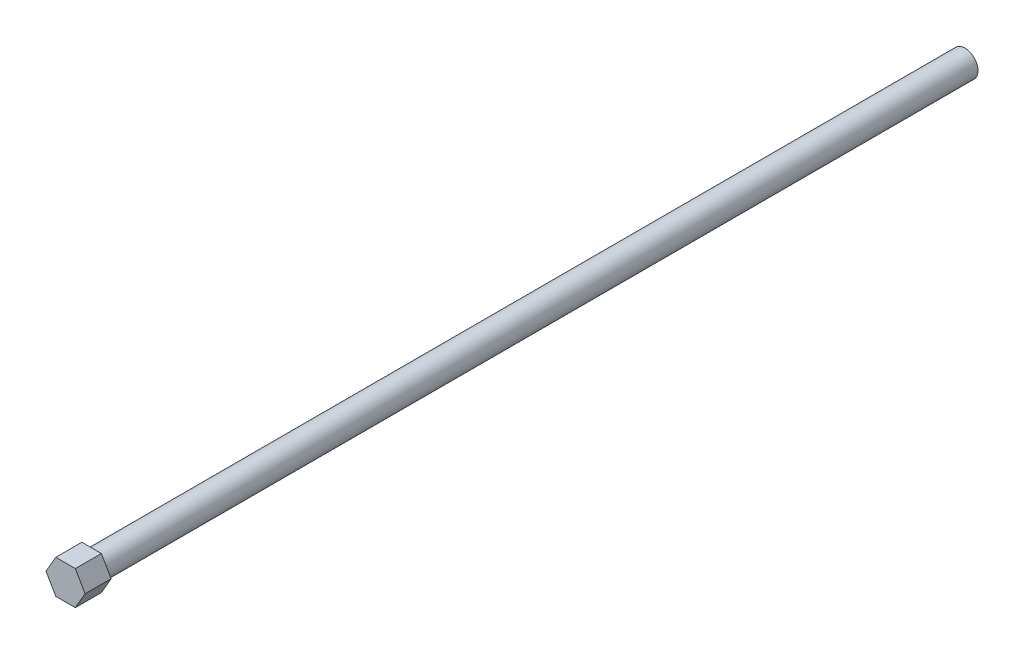
ISO-10303-21;
HEADER;
FILE_DESCRIPTION(('STEP AP214'),'2;1');
FILE_NAME('part.step','',(''),(''),'','','');
FILE_SCHEMA(('AUTOMOTIVE_DESIGN { 1 0 10303 214 1 1 1 1 }'));
ENDSEC;
DATA;
#1=APPLICATION_CONTEXT('core data for automotive mechanical design processes');
#2=APPLICATION_PROTOCOL_DEFINITION('international standard','automotive_design',2000,#1);
#3=PRODUCT_CONTEXT('',#1,'mechanical');
#4=PRODUCT('Part','Part','',(#3));
#5=PRODUCT_RELATED_PRODUCT_CATEGORY('part','',(#4));
#6=PRODUCT_DEFINITION_FORMATION('','',#4);
#7=PRODUCT_DEFINITION_CONTEXT('part definition',#1,'design');
#8=PRODUCT_DEFINITION('design','',#6,#7);
#9=PRODUCT_DEFINITION_SHAPE('','',#8);
#10=(LENGTH_UNIT() NAMED_UNIT(*) SI_UNIT(.MILLI.,.METRE.));
#11=(NAMED_UNIT(*) PLANE_ANGLE_UNIT() SI_UNIT($,.RADIAN.));
#12=(NAMED_UNIT(*) SI_UNIT($,.STERADIAN.) SOLID_ANGLE_UNIT());
#13=UNCERTAINTY_MEASURE_WITH_UNIT(LENGTH_MEASURE(1.E-05),#10,'distance_accuracy_value','');
#14=(GEOMETRIC_REPRESENTATION_CONTEXT(3) GLOBAL_UNCERTAINTY_ASSIGNED_CONTEXT((#13)) GLOBAL_UNIT_ASSIGNED_CONTEXT((#10,
#11,#12)) REPRESENTATION_CONTEXT('',''));
#15=CARTESIAN_POINT('',(0.,0.,0.));
#16=DIRECTION('',(0.,0.,1.));
#17=DIRECTION('',(1.,0.,0.));
#18=AXIS2_PLACEMENT_3D('',#15,#16,#17);
#19=CARTESIAN_POINT('',(0.,0.,280.));
#20=DIRECTION('',(0.,0.,-1.));
#21=DIRECTION('',(-1.,0.,0.));
#22=AXIS2_PLACEMENT_3D('',#19,#20,#21);
#23=CYLINDRICAL_SURFACE('',#22,5.);
#24=CARTESIAN_POINT('',(0.,0.,280.));
#25=DIRECTION('',(0.,0.,1.));
#26=DIRECTION('',(1.,0.,0.));
#27=AXIS2_PLACEMENT_3D('',#24,#25,#26);
#28=CIRCLE('',#27,5.);
#29=CARTESIAN_POINT('',(5.,0.,280.));
#30=VERTEX_POINT('',#29);
#31=EDGE_CURVE('E11',#30,#30,#28,.T.);
#32=ORIENTED_EDGE('',*,*,#31,.F.);
#33=EDGE_LOOP('',(#32));
#34=FACE_BOUND('',#33,.T.);
#35=CARTESIAN_POINT('',(0.,0.,-55.));
#36=DIRECTION('',(0.,0.,-1.));
#37=DIRECTION('',(-1.,0.,0.));
#38=AXIS2_PLACEMENT_3D('',#35,#36,#37);
#39=CIRCLE('',#38,5.);
#40=CARTESIAN_POINT('',(-5.,0.,-55.));
#41=VERTEX_POINT('',#40);
#42=EDGE_CURVE('E124',#41,#41,#39,.T.);
#43=ORIENTED_EDGE('',*,*,#42,.F.);
#44=EDGE_LOOP('',(#43));
#45=FACE_BOUND('',#44,.T.);
#46=ADVANCED_FACE('F35',(#34,#45),#23,.T.);
#47=CARTESIAN_POINT('',(-3.75,-6.49519052838329,290.));
#48=DIRECTION('',(0.,1.,0.));
#49=DIRECTION('',(-1.,0.,0.));
#50=AXIS2_PLACEMENT_3D('',#47,#48,#49);
#51=PLANE('',#50);
#52=DIRECTION('',(1.,0.,0.));
#53=VECTOR('',#52,1.);
#54=CARTESIAN_POINT('',(-3.75,-6.49519052838329,280.));
#55=LINE('',#54,#53);
#56=CARTESIAN_POINT('',(-3.75,-6.49519052838329,280.));
#57=VERTEX_POINT('',#56);
#58=CARTESIAN_POINT('',(3.75,-6.49519052838329,280.));
#59=VERTEX_POINT('',#58);
#60=EDGE_CURVE('E120',#57,#59,#55,.T.);
#61=ORIENTED_EDGE('',*,*,#60,.T.);
#62=DIRECTION('',(0.,0.,-1.));
#63=VECTOR('',#62,1.);
#64=CARTESIAN_POINT('',(3.75,-6.49519052838329,290.));
#65=LINE('',#64,#63);
#66=CARTESIAN_POINT('',(3.75,-6.49519052838329,290.));
#67=VERTEX_POINT('',#66);
#68=EDGE_CURVE('E43',#67,#59,#65,.T.);
#69=ORIENTED_EDGE('',*,*,#68,.F.);
#70=DIRECTION('',(1.,0.,0.));
#71=VECTOR('',#70,1.);
#72=CARTESIAN_POINT('',(-3.75,-6.49519052838329,290.));
#73=LINE('',#72,#71);
#74=CARTESIAN_POINT('',(-3.75,-6.49519052838329,290.));
#75=VERTEX_POINT('',#74);
#76=EDGE_CURVE('E131',#75,#67,#73,.T.);
#77=ORIENTED_EDGE('',*,*,#76,.F.);
#78=DIRECTION('',(0.,0.,-1.));
#79=VECTOR('',#78,1.);
#80=CARTESIAN_POINT('',(-3.75,-6.49519052838329,290.));
#81=LINE('',#80,#79);
#82=EDGE_CURVE('E116',#75,#57,#81,.T.);
#83=ORIENTED_EDGE('',*,*,#82,.T.);
#84=EDGE_LOOP('',(#61,#69,#77,#83));
#85=FACE_BOUND('',#84,.T.);
#86=ADVANCED_FACE('F142',(#85),#51,.F.);
#87=CARTESIAN_POINT('',(3.75,-6.49519052838329,290.));
#88=DIRECTION('',(-0.866025403784439,0.5,0.));
#89=DIRECTION('',(-0.5,-0.866025403784439,0.));
#90=AXIS2_PLACEMENT_3D('',#87,#88,#89);
#91=PLANE('',#90);
#92=DIRECTION('',(0.5,0.866025403784439,0.));
#93=VECTOR('',#92,1.);
#94=CARTESIAN_POINT('',(3.75,-6.49519052838329,280.));
#95=LINE('',#94,#93);
#96=CARTESIAN_POINT('',(7.5,0.,280.));
#97=VERTEX_POINT('',#96);
#98=EDGE_CURVE('E123',#59,#97,#95,.T.);
#99=ORIENTED_EDGE('',*,*,#98,.T.);
#100=DIRECTION('',(0.,0.,-1.));
#101=VECTOR('',#100,1.);
#102=CARTESIAN_POINT('',(7.5,0.,290.));
#103=LINE('',#102,#101);
#104=CARTESIAN_POINT('',(7.5,0.,290.));
#105=VERTEX_POINT('',#104);
#106=EDGE_CURVE('E135',#105,#97,#103,.T.);
#107=ORIENTED_EDGE('',*,*,#106,.F.);
#108=DIRECTION('',(0.5,0.866025403784439,0.));
#109=VECTOR('',#108,1.);
#110=CARTESIAN_POINT('',(3.75,-6.49519052838329,290.));
#111=LINE('',#110,#109);
#112=EDGE_CURVE('E89',#67,#105,#111,.T.);
#113=ORIENTED_EDGE('',*,*,#112,.F.);
#114=ORIENTED_EDGE('',*,*,#68,.T.);
#115=EDGE_LOOP('',(#99,#107,#113,#114));
#116=FACE_BOUND('',#115,.T.);
#117=ADVANCED_FACE('F138',(#116),#91,.F.);
#118=CARTESIAN_POINT('',(7.5,0.,290.));
#119=DIRECTION('',(-0.866025403784438,-0.5,0.));
#120=DIRECTION('',(0.5,-0.866025403784438,0.));
#121=AXIS2_PLACEMENT_3D('',#118,#119,#120);
#122=PLANE('',#121);
#123=DIRECTION('',(-0.5,0.866025403784438,0.));
#124=VECTOR('',#123,1.);
#125=CARTESIAN_POINT('',(7.5,0.,280.));
#126=LINE('',#125,#124);
#127=CARTESIAN_POINT('',(3.75,6.49519052838329,280.));
#128=VERTEX_POINT('',#127);
#129=EDGE_CURVE('E126',#97,#128,#126,.T.);
#130=ORIENTED_EDGE('',*,*,#129,.T.);
#131=DIRECTION('',(0.,0.,-1.));
#132=VECTOR('',#131,1.);
#133=CARTESIAN_POINT('',(3.75,6.49519052838329,290.));
#134=LINE('',#133,#132);
#135=CARTESIAN_POINT('',(3.75,6.49519052838329,290.));
#136=VERTEX_POINT('',#135);
#137=EDGE_CURVE('E111',#136,#128,#134,.T.);
#138=ORIENTED_EDGE('',*,*,#137,.F.);
#139=DIRECTION('',(-0.5,0.866025403784438,0.));
#140=VECTOR('',#139,1.);
#141=CARTESIAN_POINT('',(7.5,0.,290.));
#142=LINE('',#141,#140);
#143=EDGE_CURVE('E102',#105,#136,#142,.T.);
#144=ORIENTED_EDGE('',*,*,#143,.F.);
#145=ORIENTED_EDGE('',*,*,#106,.T.);
#146=EDGE_LOOP('',(#130,#138,#144,#145));
#147=FACE_BOUND('',#146,.T.);
#148=ADVANCED_FACE('F147',(#147),#122,.F.);
#149=CARTESIAN_POINT('',(3.75,6.49519052838329,290.));
#150=DIRECTION('',(0.,-1.,0.));
#151=DIRECTION('',(1.,0.,0.));
#152=AXIS2_PLACEMENT_3D('',#149,#150,#151);
#153=PLANE('',#152);
#154=DIRECTION('',(-1.,0.,0.));
#155=VECTOR('',#154,1.);
#156=CARTESIAN_POINT('',(3.75,6.49519052838329,280.));
#157=LINE('',#156,#155);
#158=CARTESIAN_POINT('',(-3.75,6.49519052838329,280.));
#159=VERTEX_POINT('',#158);
#160=EDGE_CURVE('E110',#128,#159,#157,.T.);
#161=ORIENTED_EDGE('',*,*,#160,.T.);
#162=DIRECTION('',(0.,0.,-1.));
#163=VECTOR('',#162,1.);
#164=CARTESIAN_POINT('',(-3.75,6.49519052838329,290.));
#165=LINE('',#164,#163);
#166=CARTESIAN_POINT('',(-3.75,6.49519052838329,290.));
#167=VERTEX_POINT('',#166);
#168=EDGE_CURVE('E107',#167,#159,#165,.T.);
#169=ORIENTED_EDGE('',*,*,#168,.F.);
#170=DIRECTION('',(-1.,0.,0.));
#171=VECTOR('',#170,1.);
#172=CARTESIAN_POINT('',(3.75,6.49519052838329,290.));
#173=LINE('',#172,#171);
#174=EDGE_CURVE('E96',#136,#167,#173,.T.);
#175=ORIENTED_EDGE('',*,*,#174,.F.);
#176=ORIENTED_EDGE('',*,*,#137,.T.);
#177=EDGE_LOOP('',(#161,#169,#175,#176));
#178=FACE_BOUND('',#177,.T.);
#179=ADVANCED_FACE('F108',(#178),#153,.F.);
#180=CARTESIAN_POINT('',(-3.75,6.49519052838329,290.));
#181=DIRECTION('',(0.866025403784439,-0.5,0.));
#182=DIRECTION('',(0.5,0.866025403784439,0.));
#183=AXIS2_PLACEMENT_3D('',#180,#181,#182);
#184=PLANE('',#183);
#185=DIRECTION('',(-0.5,-0.866025403784439,0.));
#186=VECTOR('',#185,1.);
#187=CARTESIAN_POINT('',(-3.75,6.49519052838329,280.));
#188=LINE('',#187,#186);
#189=CARTESIAN_POINT('',(-7.5,0.,280.));
#190=VERTEX_POINT('',#189);
#191=EDGE_CURVE('E74',#159,#190,#188,.T.);
#192=ORIENTED_EDGE('',*,*,#191,.T.);
#193=DIRECTION('',(0.,0.,-1.));
#194=VECTOR('',#193,1.);
#195=CARTESIAN_POINT('',(-7.5,0.,290.));
#196=LINE('',#195,#194);
#197=CARTESIAN_POINT('',(-7.5,0.,290.));
#198=VERTEX_POINT('',#197);
#199=EDGE_CURVE('E112',#198,#190,#196,.T.);
#200=ORIENTED_EDGE('',*,*,#199,.F.);
#201=DIRECTION('',(-0.5,-0.866025403784439,0.));
#202=VECTOR('',#201,1.);
#203=CARTESIAN_POINT('',(-3.75,6.49519052838329,290.));
#204=LINE('',#203,#202);
#205=EDGE_CURVE('E100',#167,#198,#204,.T.);
#206=ORIENTED_EDGE('',*,*,#205,.F.);
#207=ORIENTED_EDGE('',*,*,#168,.T.);
#208=EDGE_LOOP('',(#192,#200,#206,#207));
#209=FACE_BOUND('',#208,.T.);
#210=ADVANCED_FACE('F114',(#209),#184,.F.);
#211=CARTESIAN_POINT('',(-7.5,0.,290.));
#212=DIRECTION('',(0.866025403784439,0.5,0.));
#213=DIRECTION('',(-0.5,0.866025403784439,0.));
#214=AXIS2_PLACEMENT_3D('',#211,#212,#213);
#215=PLANE('',#214);
#216=DIRECTION('',(0.5,-0.866025403784439,0.));
#217=VECTOR('',#216,1.);
#218=CARTESIAN_POINT('',(-7.5,0.,280.));
#219=LINE('',#218,#217);
#220=EDGE_CURVE('E80',#190,#57,#219,.T.);
#221=ORIENTED_EDGE('',*,*,#220,.T.);
#222=ORIENTED_EDGE('',*,*,#82,.F.);
#223=DIRECTION('',(0.5,-0.866025403784439,0.));
#224=VECTOR('',#223,1.);
#225=CARTESIAN_POINT('',(-7.5,0.,290.));
#226=LINE('',#225,#224);
#227=EDGE_CURVE('E51',#198,#75,#226,.T.);
#228=ORIENTED_EDGE('',*,*,#227,.F.);
#229=ORIENTED_EDGE('',*,*,#199,.T.);
#230=EDGE_LOOP('',(#221,#222,#228,#229));
#231=FACE_BOUND('',#230,.T.);
#232=ADVANCED_FACE('F170',(#231),#215,.F.);
#233=CARTESIAN_POINT('',(0.,0.,290.));
#234=DIRECTION('',(0.,0.,1.));
#235=DIRECTION('',(1.,0.,0.));
#236=AXIS2_PLACEMENT_3D('',#233,#234,#235);
#237=PLANE('',#236);
#238=ORIENTED_EDGE('',*,*,#76,.T.);
#239=ORIENTED_EDGE('',*,*,#112,.T.);
#240=ORIENTED_EDGE('',*,*,#143,.T.);
#241=ORIENTED_EDGE('',*,*,#174,.T.);
#242=ORIENTED_EDGE('',*,*,#205,.T.);
#243=ORIENTED_EDGE('',*,*,#227,.T.);
#244=EDGE_LOOP('',(#238,#239,#240,#241,#242,#243));
#245=FACE_BOUND('',#244,.T.);
#246=ADVANCED_FACE('F98',(#245),#237,.T.);
#247=CARTESIAN_POINT('',(0.,0.,280.));
#248=DIRECTION('',(0.,0.,1.));
#249=DIRECTION('',(1.,0.,0.));
#250=AXIS2_PLACEMENT_3D('',#247,#248,#249);
#251=PLANE('',#250);
#252=ORIENTED_EDGE('',*,*,#31,.T.);
#253=EDGE_LOOP('',(#252));
#254=FACE_BOUND('',#253,.T.);
#255=ORIENTED_EDGE('',*,*,#60,.F.);
#256=ORIENTED_EDGE('',*,*,#220,.F.);
#257=ORIENTED_EDGE('',*,*,#191,.F.);
#258=ORIENTED_EDGE('',*,*,#160,.F.);
#259=ORIENTED_EDGE('',*,*,#129,.F.);
#260=ORIENTED_EDGE('',*,*,#98,.F.);
#261=EDGE_LOOP('',(#255,#256,#257,#258,#259,#260));
#262=FACE_BOUND('',#261,.T.);
#263=ADVANCED_FACE('F144',(#254,#262),#251,.F.);
#264=CARTESIAN_POINT('',(0.,0.,-55.));
#265=DIRECTION('',(0.,0.,-1.));
#266=DIRECTION('',(-1.,0.,0.));
#267=AXIS2_PLACEMENT_3D('',#264,#265,#266);
#268=PLANE('',#267);
#269=ORIENTED_EDGE('',*,*,#42,.T.);
#270=EDGE_LOOP('',(#269));
#271=FACE_BOUND('',#270,.T.);
#272=ADVANCED_FACE('F154',(#271),#268,.T.);
#273=CLOSED_SHELL('',(#46,#86,#117,#148,#179,#210,#232,#246,#263,#272));
#274=MANIFOLD_SOLID_BREP('B2',#273);
#275=ADVANCED_BREP_SHAPE_REPRESENTATION('',(#18,#274),#14);
#276=SHAPE_DEFINITION_REPRESENTATION(#9,#275);
ENDSEC;
END-ISO-10303-21;
